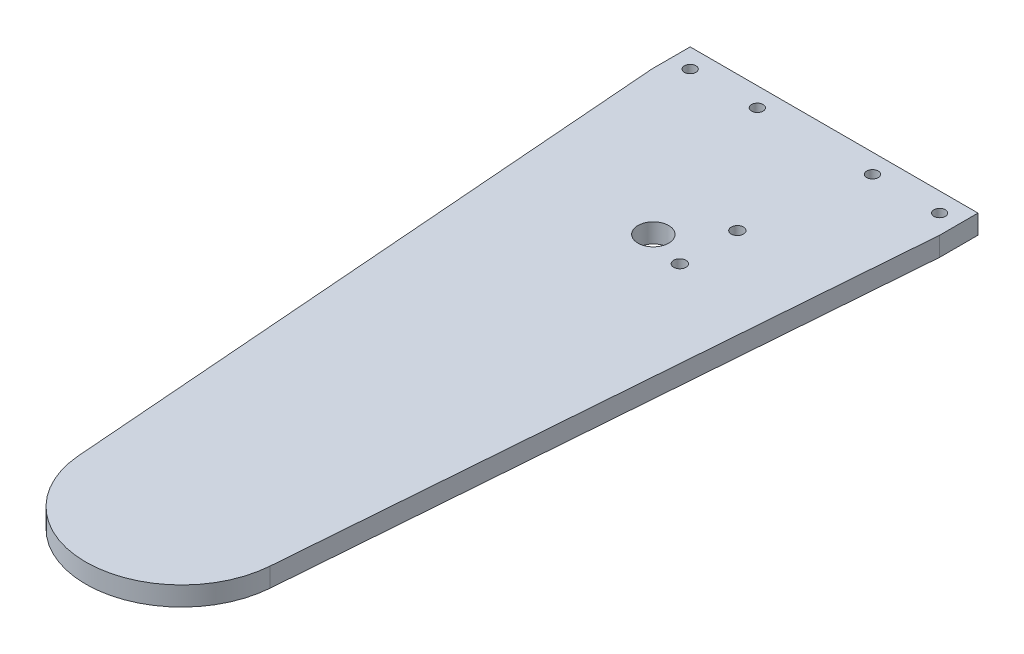
ISO-10303-21;
HEADER;
FILE_DESCRIPTION(('STEP AP214'),'2;1');
FILE_NAME('part.step','',(''),(''),'','','');
FILE_SCHEMA(('AUTOMOTIVE_DESIGN { 1 0 10303 214 1 1 1 1 }'));
ENDSEC;
DATA;
#1=APPLICATION_CONTEXT('core data for automotive mechanical design processes');
#2=APPLICATION_PROTOCOL_DEFINITION('international standard','automotive_design',2000,#1);
#3=PRODUCT_CONTEXT('',#1,'mechanical');
#4=PRODUCT('Part','Part','',(#3));
#5=PRODUCT_RELATED_PRODUCT_CATEGORY('part','',(#4));
#6=PRODUCT_DEFINITION_FORMATION('','',#4);
#7=PRODUCT_DEFINITION_CONTEXT('part definition',#1,'design');
#8=PRODUCT_DEFINITION('design','',#6,#7);
#9=PRODUCT_DEFINITION_SHAPE('','',#8);
#10=(LENGTH_UNIT() NAMED_UNIT(*) SI_UNIT(.MILLI.,.METRE.));
#11=(NAMED_UNIT(*) PLANE_ANGLE_UNIT() SI_UNIT($,.RADIAN.));
#12=(NAMED_UNIT(*) SI_UNIT($,.STERADIAN.) SOLID_ANGLE_UNIT());
#13=UNCERTAINTY_MEASURE_WITH_UNIT(LENGTH_MEASURE(1.E-05),#10,'distance_accuracy_value','');
#14=(GEOMETRIC_REPRESENTATION_CONTEXT(3) GLOBAL_UNCERTAINTY_ASSIGNED_CONTEXT((#13)) GLOBAL_UNIT_ASSIGNED_CONTEXT((#10,
#11,#12)) REPRESENTATION_CONTEXT('',''));
#15=CARTESIAN_POINT('',(0.,0.,0.));
#16=DIRECTION('',(0.,0.,1.));
#17=DIRECTION('',(1.,0.,0.));
#18=AXIS2_PLACEMENT_3D('',#15,#16,#17);
#19=CARTESIAN_POINT('',(37.5,5.,170.));
#20=DIRECTION('',(0.,1.,0.));
#21=DIRECTION('',(0.,0.,1.));
#22=AXIS2_PLACEMENT_3D('',#19,#20,#21);
#23=PLANE('',#22);
#24=CARTESIAN_POINT('',(47.6,5.,50.3));
#25=DIRECTION('',(0.,1.,0.));
#26=DIRECTION('',(0.,0.,1.));
#27=AXIS2_PLACEMENT_3D('',#24,#25,#26);
#28=CIRCLE('',#27,1.6);
#29=CARTESIAN_POINT('',(47.6,5.,51.9));
#30=VERTEX_POINT('',#29);
#31=EDGE_CURVE('E203',#30,#30,#28,.T.);
#32=ORIENTED_EDGE('',*,*,#31,.F.);
#33=EDGE_LOOP('',(#32));
#34=FACE_BOUND('',#33,.T.);
#35=CARTESIAN_POINT('',(52.5,5.,5.));
#36=DIRECTION('',(0.,1.,0.));
#37=DIRECTION('',(0.,0.,-1.));
#38=AXIS2_PLACEMENT_3D('',#35,#36,#37);
#39=CIRCLE('',#38,1.5);
#40=CARTESIAN_POINT('',(52.5,5.,3.5));
#41=VERTEX_POINT('',#40);
#42=EDGE_CURVE('E215',#41,#41,#39,.T.);
#43=ORIENTED_EDGE('',*,*,#42,.F.);
#44=EDGE_LOOP('',(#43));
#45=FACE_BOUND('',#44,.T.);
#46=CARTESIAN_POINT('',(70.,5.,4.99999999999999));
#47=DIRECTION('',(0.,1.,0.));
#48=DIRECTION('',(0.,0.,-1.));
#49=AXIS2_PLACEMENT_3D('',#46,#47,#48);
#50=CIRCLE('',#49,1.50000000000001);
#51=CARTESIAN_POINT('',(70.,5.,3.49999999999998));
#52=VERTEX_POINT('',#51);
#53=EDGE_CURVE('E227',#52,#52,#50,.T.);
#54=ORIENTED_EDGE('',*,*,#53,.F.);
#55=EDGE_LOOP('',(#54));
#56=FACE_BOUND('',#55,.T.);
#57=DIRECTION('',(-1.,0.,0.));
#58=VECTOR('',#57,1.);
#59=CARTESIAN_POINT('',(75.,5.,0.));
#60=LINE('',#59,#58);
#61=CARTESIAN_POINT('',(75.,5.,0.));
#62=VERTEX_POINT('',#61);
#63=CARTESIAN_POINT('',(0.,5.,0.));
#64=VERTEX_POINT('',#63);
#65=EDGE_CURVE('E131',#62,#64,#60,.T.);
#66=ORIENTED_EDGE('',*,*,#65,.T.);
#67=DIRECTION('',(0.,0.,1.));
#68=VECTOR('',#67,1.);
#69=CARTESIAN_POINT('',(0.,5.,0.));
#70=LINE('',#69,#68);
#71=CARTESIAN_POINT('',(0.,5.,10.));
#72=VERTEX_POINT('',#71);
#73=EDGE_CURVE('E89',#64,#72,#70,.T.);
#74=ORIENTED_EDGE('',*,*,#73,.T.);
#75=DIRECTION('',(0.0774215117442369,0.,0.996998450108744));
#76=VECTOR('',#75,1.);
#77=CARTESIAN_POINT('',(0.,5.,10.));
#78=LINE('',#77,#76);
#79=CARTESIAN_POINT('',(12.5750387472814,5.,171.935537793606));
#80=VERTEX_POINT('',#79);
#81=EDGE_CURVE('E102',#72,#80,#78,.T.);
#82=ORIENTED_EDGE('',*,*,#81,.T.);
#83=CARTESIAN_POINT('',(37.5,5.,170.));
#84=DIRECTION('',(0.,1.,0.));
#85=DIRECTION('',(0.,0.,1.));
#86=AXIS2_PLACEMENT_3D('',#83,#84,#85);
#87=CIRCLE('',#86,25.);
#88=CARTESIAN_POINT('',(62.4249612527186,5.,171.935537793606));
#89=VERTEX_POINT('',#88);
#90=EDGE_CURVE('E96',#80,#89,#87,.T.);
#91=ORIENTED_EDGE('',*,*,#90,.T.);
#92=DIRECTION('',(0.0774215117442367,0.,-0.996998450108744));
#93=VECTOR('',#92,1.);
#94=CARTESIAN_POINT('',(62.4249612527186,5.,171.935537793606));
#95=LINE('',#94,#93);
#96=CARTESIAN_POINT('',(75.,5.,10.));
#97=VERTEX_POINT('',#96);
#98=EDGE_CURVE('E100',#89,#97,#95,.T.);
#99=ORIENTED_EDGE('',*,*,#98,.T.);
#100=DIRECTION('',(0.,0.,-1.));
#101=VECTOR('',#100,1.);
#102=CARTESIAN_POINT('',(75.,5.,10.));
#103=LINE('',#102,#101);
#104=EDGE_CURVE('E52',#97,#62,#103,.T.);
#105=ORIENTED_EDGE('',*,*,#104,.T.);
#106=EDGE_LOOP('',(#66,#74,#82,#91,#99,#105));
#107=FACE_BOUND('',#106,.T.);
#108=CARTESIAN_POINT('',(5.,5.,5.));
#109=DIRECTION('',(0.,1.,0.));
#110=DIRECTION('',(0.,0.,1.));
#111=AXIS2_PLACEMENT_3D('',#108,#109,#110);
#112=CIRCLE('',#111,1.5);
#113=CARTESIAN_POINT('',(5.,5.,6.5));
#114=VERTEX_POINT('',#113);
#115=EDGE_CURVE('E124',#114,#114,#112,.T.);
#116=ORIENTED_EDGE('',*,*,#115,.F.);
#117=EDGE_LOOP('',(#116));
#118=FACE_BOUND('',#117,.T.);
#119=CARTESIAN_POINT('',(22.5,5.,5.));
#120=DIRECTION('',(0.,1.,0.));
#121=DIRECTION('',(0.,0.,1.));
#122=AXIS2_PLACEMENT_3D('',#119,#120,#121);
#123=CIRCLE('',#122,1.5);
#124=CARTESIAN_POINT('',(22.5,5.,6.5));
#125=VERTEX_POINT('',#124);
#126=EDGE_CURVE('E221',#125,#125,#123,.T.);
#127=ORIENTED_EDGE('',*,*,#126,.F.);
#128=EDGE_LOOP('',(#127));
#129=FACE_BOUND('',#128,.T.);
#130=CARTESIAN_POINT('',(47.6,5.,35.3));
#131=DIRECTION('',(0.,1.,0.));
#132=DIRECTION('',(0.,0.,1.));
#133=AXIS2_PLACEMENT_3D('',#130,#131,#132);
#134=CIRCLE('',#133,1.6);
#135=CARTESIAN_POINT('',(47.6,5.,36.9));
#136=VERTEX_POINT('',#135);
#137=EDGE_CURVE('E209',#136,#136,#134,.T.);
#138=ORIENTED_EDGE('',*,*,#137,.F.);
#139=EDGE_LOOP('',(#138));
#140=FACE_BOUND('',#139,.T.);
#141=CARTESIAN_POINT('',(37.5,5.,47.1));
#142=DIRECTION('',(0.,1.,0.));
#143=DIRECTION('',(0.,0.,1.));
#144=AXIS2_PLACEMENT_3D('',#141,#142,#143);
#145=CIRCLE('',#144,4.00000000000001);
#146=CARTESIAN_POINT('',(37.5,5.,51.1));
#147=VERTEX_POINT('',#146);
#148=EDGE_CURVE('E194',#147,#147,#145,.T.);
#149=ORIENTED_EDGE('',*,*,#148,.F.);
#150=EDGE_LOOP('',(#149));
#151=FACE_BOUND('',#150,.T.);
#152=ADVANCED_FACE('F35',(#34,#45,#56,#107,#118,#129,#140,#151),#23,.T.);
#153=CARTESIAN_POINT('',(37.5,0.,170.));
#154=DIRECTION('',(0.,1.,0.));
#155=DIRECTION('',(0.,0.,1.));
#156=AXIS2_PLACEMENT_3D('',#153,#154,#155);
#157=PLANE('',#156);
#158=DIRECTION('',(-1.,0.,0.));
#159=VECTOR('',#158,1.);
#160=CARTESIAN_POINT('',(75.,0.,0.));
#161=LINE('',#160,#159);
#162=CARTESIAN_POINT('',(75.,0.,0.));
#163=VERTEX_POINT('',#162);
#164=CARTESIAN_POINT('',(0.,0.,0.));
#165=VERTEX_POINT('',#164);
#166=EDGE_CURVE('E120',#163,#165,#161,.T.);
#167=ORIENTED_EDGE('',*,*,#166,.F.);
#168=DIRECTION('',(0.,0.,-1.));
#169=VECTOR('',#168,1.);
#170=CARTESIAN_POINT('',(75.,0.,10.));
#171=LINE('',#170,#169);
#172=CARTESIAN_POINT('',(75.,0.,10.));
#173=VERTEX_POINT('',#172);
#174=EDGE_CURVE('E81',#173,#163,#171,.T.);
#175=ORIENTED_EDGE('',*,*,#174,.F.);
#176=DIRECTION('',(0.0774215117442367,0.,-0.996998450108744));
#177=VECTOR('',#176,1.);
#178=CARTESIAN_POINT('',(62.4249612527186,0.,171.935537793606));
#179=LINE('',#178,#177);
#180=CARTESIAN_POINT('',(62.4249612527186,0.,171.935537793606));
#181=VERTEX_POINT('',#180);
#182=EDGE_CURVE('E75',#181,#173,#179,.T.);
#183=ORIENTED_EDGE('',*,*,#182,.F.);
#184=CARTESIAN_POINT('',(37.5,0.,170.));
#185=DIRECTION('',(0.,1.,0.));
#186=DIRECTION('',(0.,0.,1.));
#187=AXIS2_PLACEMENT_3D('',#184,#185,#186);
#188=CIRCLE('',#187,25.);
#189=CARTESIAN_POINT('',(12.5750387472814,0.,171.935537793606));
#190=VERTEX_POINT('',#189);
#191=EDGE_CURVE('E110',#190,#181,#188,.T.);
#192=ORIENTED_EDGE('',*,*,#191,.F.);
#193=DIRECTION('',(0.0774215117442369,0.,0.996998450108744));
#194=VECTOR('',#193,1.);
#195=CARTESIAN_POINT('',(0.,0.,10.));
#196=LINE('',#195,#194);
#197=CARTESIAN_POINT('',(0.,0.,10.));
#198=VERTEX_POINT('',#197);
#199=EDGE_CURVE('E126',#198,#190,#196,.T.);
#200=ORIENTED_EDGE('',*,*,#199,.F.);
#201=DIRECTION('',(0.,0.,1.));
#202=VECTOR('',#201,1.);
#203=CARTESIAN_POINT('',(0.,0.,0.));
#204=LINE('',#203,#202);
#205=EDGE_CURVE('E123',#165,#198,#204,.T.);
#206=ORIENTED_EDGE('',*,*,#205,.F.);
#207=EDGE_LOOP('',(#167,#175,#183,#192,#200,#206));
#208=FACE_BOUND('',#207,.T.);
#209=CARTESIAN_POINT('',(5.,0.,5.));
#210=DIRECTION('',(0.,1.,0.));
#211=DIRECTION('',(0.,0.,1.));
#212=AXIS2_PLACEMENT_3D('',#209,#210,#211);
#213=CIRCLE('',#212,1.5);
#214=CARTESIAN_POINT('',(5.,0.,6.5));
#215=VERTEX_POINT('',#214);
#216=EDGE_CURVE('E230',#215,#215,#213,.T.);
#217=ORIENTED_EDGE('',*,*,#216,.T.);
#218=EDGE_LOOP('',(#217));
#219=FACE_BOUND('',#218,.T.);
#220=CARTESIAN_POINT('',(70.,0.,4.99999999999999));
#221=DIRECTION('',(0.,1.,0.));
#222=DIRECTION('',(0.,0.,-1.));
#223=AXIS2_PLACEMENT_3D('',#220,#221,#222);
#224=CIRCLE('',#223,1.50000000000001);
#225=CARTESIAN_POINT('',(70.,0.,3.49999999999998));
#226=VERTEX_POINT('',#225);
#227=EDGE_CURVE('E224',#226,#226,#224,.T.);
#228=ORIENTED_EDGE('',*,*,#227,.T.);
#229=EDGE_LOOP('',(#228));
#230=FACE_BOUND('',#229,.T.);
#231=CARTESIAN_POINT('',(22.5,0.,5.));
#232=DIRECTION('',(0.,1.,0.));
#233=DIRECTION('',(0.,0.,1.));
#234=AXIS2_PLACEMENT_3D('',#231,#232,#233);
#235=CIRCLE('',#234,1.5);
#236=CARTESIAN_POINT('',(22.5,0.,6.5));
#237=VERTEX_POINT('',#236);
#238=EDGE_CURVE('E218',#237,#237,#235,.T.);
#239=ORIENTED_EDGE('',*,*,#238,.T.);
#240=EDGE_LOOP('',(#239));
#241=FACE_BOUND('',#240,.T.);
#242=CARTESIAN_POINT('',(52.5,0.,5.));
#243=DIRECTION('',(0.,1.,0.));
#244=DIRECTION('',(0.,0.,-1.));
#245=AXIS2_PLACEMENT_3D('',#242,#243,#244);
#246=CIRCLE('',#245,1.5);
#247=CARTESIAN_POINT('',(52.5,0.,3.5));
#248=VERTEX_POINT('',#247);
#249=EDGE_CURVE('E212',#248,#248,#246,.T.);
#250=ORIENTED_EDGE('',*,*,#249,.T.);
#251=EDGE_LOOP('',(#250));
#252=FACE_BOUND('',#251,.T.);
#253=CARTESIAN_POINT('',(47.6,0.,35.3));
#254=DIRECTION('',(0.,1.,0.));
#255=DIRECTION('',(0.,0.,1.));
#256=AXIS2_PLACEMENT_3D('',#253,#254,#255);
#257=CIRCLE('',#256,1.6);
#258=CARTESIAN_POINT('',(47.6,0.,36.9));
#259=VERTEX_POINT('',#258);
#260=EDGE_CURVE('E206',#259,#259,#257,.T.);
#261=ORIENTED_EDGE('',*,*,#260,.T.);
#262=EDGE_LOOP('',(#261));
#263=FACE_BOUND('',#262,.T.);
#264=CARTESIAN_POINT('',(47.6,0.,50.3));
#265=DIRECTION('',(0.,1.,0.));
#266=DIRECTION('',(0.,0.,1.));
#267=AXIS2_PLACEMENT_3D('',#264,#265,#266);
#268=CIRCLE('',#267,1.6);
#269=CARTESIAN_POINT('',(47.6,0.,51.9));
#270=VERTEX_POINT('',#269);
#271=EDGE_CURVE('E200',#270,#270,#268,.T.);
#272=ORIENTED_EDGE('',*,*,#271,.T.);
#273=EDGE_LOOP('',(#272));
#274=FACE_BOUND('',#273,.T.);
#275=CARTESIAN_POINT('',(37.5,0.,47.1));
#276=DIRECTION('',(0.,1.,0.));
#277=DIRECTION('',(0.,0.,1.));
#278=AXIS2_PLACEMENT_3D('',#275,#276,#277);
#279=CIRCLE('',#278,4.00000000000001);
#280=CARTESIAN_POINT('',(37.5,0.,51.1));
#281=VERTEX_POINT('',#280);
#282=EDGE_CURVE('E197',#281,#281,#279,.T.);
#283=ORIENTED_EDGE('',*,*,#282,.T.);
#284=EDGE_LOOP('',(#283));
#285=FACE_BOUND('',#284,.T.);
#286=ADVANCED_FACE('F140',(#208,#219,#230,#241,#252,#263,#274,#285),#157,.F.);
#287=CARTESIAN_POINT('',(75.,5.,0.));
#288=DIRECTION('',(0.,0.,1.));
#289=DIRECTION('',(1.,0.,0.));
#290=AXIS2_PLACEMENT_3D('',#287,#288,#289);
#291=PLANE('',#290);
#292=ORIENTED_EDGE('',*,*,#166,.T.);
#293=DIRECTION('',(0.,-1.,0.));
#294=VECTOR('',#293,1.);
#295=CARTESIAN_POINT('',(0.,5.,0.));
#296=LINE('',#295,#294);
#297=EDGE_CURVE('E11',#64,#165,#296,.T.);
#298=ORIENTED_EDGE('',*,*,#297,.F.);
#299=ORIENTED_EDGE('',*,*,#65,.F.);
#300=DIRECTION('',(0.,-1.,0.));
#301=VECTOR('',#300,1.);
#302=CARTESIAN_POINT('',(75.,5.,0.));
#303=LINE('',#302,#301);
#304=EDGE_CURVE('E116',#62,#163,#303,.T.);
#305=ORIENTED_EDGE('',*,*,#304,.T.);
#306=EDGE_LOOP('',(#292,#298,#299,#305));
#307=FACE_BOUND('',#306,.T.);
#308=ADVANCED_FACE('F37',(#307),#291,.F.);
#309=CARTESIAN_POINT('',(0.,5.,0.));
#310=DIRECTION('',(1.,0.,0.));
#311=DIRECTION('',(0.,0.,-1.));
#312=AXIS2_PLACEMENT_3D('',#309,#310,#311);
#313=PLANE('',#312);
#314=ORIENTED_EDGE('',*,*,#205,.T.);
#315=DIRECTION('',(0.,-1.,0.));
#316=VECTOR('',#315,1.);
#317=CARTESIAN_POINT('',(0.,5.,10.));
#318=LINE('',#317,#316);
#319=EDGE_CURVE('E44',#72,#198,#318,.T.);
#320=ORIENTED_EDGE('',*,*,#319,.F.);
#321=ORIENTED_EDGE('',*,*,#73,.F.);
#322=ORIENTED_EDGE('',*,*,#297,.T.);
#323=EDGE_LOOP('',(#314,#320,#321,#322));
#324=FACE_BOUND('',#323,.T.);
#325=ADVANCED_FACE('F315',(#324),#313,.F.);
#326=CARTESIAN_POINT('',(0.,5.,10.));
#327=DIRECTION('',(0.996998450108744,0.,-0.0774215117442369));
#328=DIRECTION('',(-0.0774215117442369,0.,-0.996998450108744));
#329=AXIS2_PLACEMENT_3D('',#326,#327,#328);
#330=PLANE('',#329);
#331=ORIENTED_EDGE('',*,*,#199,.T.);
#332=DIRECTION('',(0.,-1.,0.));
#333=VECTOR('',#332,1.);
#334=CARTESIAN_POINT('',(12.5750387472814,5.,171.935537793606));
#335=LINE('',#334,#333);
#336=EDGE_CURVE('E111',#80,#190,#335,.T.);
#337=ORIENTED_EDGE('',*,*,#336,.F.);
#338=ORIENTED_EDGE('',*,*,#81,.F.);
#339=ORIENTED_EDGE('',*,*,#319,.T.);
#340=EDGE_LOOP('',(#331,#337,#338,#339));
#341=FACE_BOUND('',#340,.T.);
#342=ADVANCED_FACE('F137',(#341),#330,.F.);
#343=CARTESIAN_POINT('',(37.5,5.,170.));
#344=DIRECTION('',(0.,-1.,0.));
#345=DIRECTION('',(0.,0.,-1.));
#346=AXIS2_PLACEMENT_3D('',#343,#344,#345);
#347=CYLINDRICAL_SURFACE('',#346,25.);
#348=ORIENTED_EDGE('',*,*,#191,.T.);
#349=DIRECTION('',(0.,-1.,0.));
#350=VECTOR('',#349,1.);
#351=CARTESIAN_POINT('',(62.4249612527186,5.,171.935537793606));
#352=LINE('',#351,#350);
#353=EDGE_CURVE('E107',#89,#181,#352,.T.);
#354=ORIENTED_EDGE('',*,*,#353,.F.);
#355=ORIENTED_EDGE('',*,*,#90,.F.);
#356=ORIENTED_EDGE('',*,*,#336,.T.);
#357=EDGE_LOOP('',(#348,#354,#355,#356));
#358=FACE_BOUND('',#357,.T.);
#359=ADVANCED_FACE('F108',(#358),#347,.T.);
#360=CARTESIAN_POINT('',(62.4249612527186,5.,171.935537793606));
#361=DIRECTION('',(-0.996998450108744,0.,-0.0774215117442367));
#362=DIRECTION('',(-0.0774215117442367,0.,0.996998450108744));
#363=AXIS2_PLACEMENT_3D('',#360,#361,#362);
#364=PLANE('',#363);
#365=ORIENTED_EDGE('',*,*,#182,.T.);
#366=DIRECTION('',(0.,-1.,0.));
#367=VECTOR('',#366,1.);
#368=CARTESIAN_POINT('',(75.,5.,10.));
#369=LINE('',#368,#367);
#370=EDGE_CURVE('E112',#97,#173,#369,.T.);
#371=ORIENTED_EDGE('',*,*,#370,.F.);
#372=ORIENTED_EDGE('',*,*,#98,.F.);
#373=ORIENTED_EDGE('',*,*,#353,.T.);
#374=EDGE_LOOP('',(#365,#371,#372,#373));
#375=FACE_BOUND('',#374,.T.);
#376=ADVANCED_FACE('F114',(#375),#364,.F.);
#377=CARTESIAN_POINT('',(75.,5.,10.));
#378=DIRECTION('',(-1.,0.,0.));
#379=DIRECTION('',(0.,0.,1.));
#380=AXIS2_PLACEMENT_3D('',#377,#378,#379);
#381=PLANE('',#380);
#382=ORIENTED_EDGE('',*,*,#174,.T.);
#383=ORIENTED_EDGE('',*,*,#304,.F.);
#384=ORIENTED_EDGE('',*,*,#104,.F.);
#385=ORIENTED_EDGE('',*,*,#370,.T.);
#386=EDGE_LOOP('',(#382,#383,#384,#385));
#387=FACE_BOUND('',#386,.T.);
#388=ADVANCED_FACE('F145',(#387),#381,.F.);
#389=CARTESIAN_POINT('',(5.,5.,5.));
#390=DIRECTION('',(0.,-1.,0.));
#391=DIRECTION('',(0.,0.,-1.));
#392=AXIS2_PLACEMENT_3D('',#389,#390,#391);
#393=CYLINDRICAL_SURFACE('',#392,1.5);
#394=ORIENTED_EDGE('',*,*,#115,.T.);
#395=EDGE_LOOP('',(#394));
#396=FACE_BOUND('',#395,.T.);
#397=ORIENTED_EDGE('',*,*,#216,.F.);
#398=EDGE_LOOP('',(#397));
#399=FACE_BOUND('',#398,.T.);
#400=ADVANCED_FACE('F147',(#396,#399),#393,.F.);
#401=CARTESIAN_POINT('',(70.,5.,4.99999999999999));
#402=DIRECTION('',(0.,-1.,0.));
#403=DIRECTION('',(0.,0.,-1.));
#404=AXIS2_PLACEMENT_3D('',#401,#402,#403);
#405=CYLINDRICAL_SURFACE('',#404,1.50000000000001);
#406=ORIENTED_EDGE('',*,*,#53,.T.);
#407=EDGE_LOOP('',(#406));
#408=FACE_BOUND('',#407,.T.);
#409=ORIENTED_EDGE('',*,*,#227,.F.);
#410=EDGE_LOOP('',(#409));
#411=FACE_BOUND('',#410,.T.);
#412=ADVANCED_FACE('F153',(#408,#411),#405,.F.);
#413=CARTESIAN_POINT('',(22.5,5.,5.));
#414=DIRECTION('',(0.,-1.,0.));
#415=DIRECTION('',(0.,0.,-1.));
#416=AXIS2_PLACEMENT_3D('',#413,#414,#415);
#417=CYLINDRICAL_SURFACE('',#416,1.5);
#418=ORIENTED_EDGE('',*,*,#126,.T.);
#419=EDGE_LOOP('',(#418));
#420=FACE_BOUND('',#419,.T.);
#421=ORIENTED_EDGE('',*,*,#238,.F.);
#422=EDGE_LOOP('',(#421));
#423=FACE_BOUND('',#422,.T.);
#424=ADVANCED_FACE('F169',(#420,#423),#417,.F.);
#425=CARTESIAN_POINT('',(52.5,5.,5.));
#426=DIRECTION('',(0.,-1.,0.));
#427=DIRECTION('',(0.,0.,-1.));
#428=AXIS2_PLACEMENT_3D('',#425,#426,#427);
#429=CYLINDRICAL_SURFACE('',#428,1.5);
#430=ORIENTED_EDGE('',*,*,#42,.T.);
#431=EDGE_LOOP('',(#430));
#432=FACE_BOUND('',#431,.T.);
#433=ORIENTED_EDGE('',*,*,#249,.F.);
#434=EDGE_LOOP('',(#433));
#435=FACE_BOUND('',#434,.T.);
#436=ADVANCED_FACE('F173',(#432,#435),#429,.F.);
#437=CARTESIAN_POINT('',(47.6,5.,35.3));
#438=DIRECTION('',(0.,-1.,0.));
#439=DIRECTION('',(0.,0.,-1.));
#440=AXIS2_PLACEMENT_3D('',#437,#438,#439);
#441=CYLINDRICAL_SURFACE('',#440,1.6);
#442=ORIENTED_EDGE('',*,*,#137,.T.);
#443=EDGE_LOOP('',(#442));
#444=FACE_BOUND('',#443,.T.);
#445=ORIENTED_EDGE('',*,*,#260,.F.);
#446=EDGE_LOOP('',(#445));
#447=FACE_BOUND('',#446,.T.);
#448=ADVANCED_FACE('F177',(#444,#447),#441,.F.);
#449=CARTESIAN_POINT('',(47.6,5.,50.3));
#450=DIRECTION('',(0.,-1.,0.));
#451=DIRECTION('',(0.,0.,-1.));
#452=AXIS2_PLACEMENT_3D('',#449,#450,#451);
#453=CYLINDRICAL_SURFACE('',#452,1.6);
#454=ORIENTED_EDGE('',*,*,#31,.T.);
#455=EDGE_LOOP('',(#454));
#456=FACE_BOUND('',#455,.T.);
#457=ORIENTED_EDGE('',*,*,#271,.F.);
#458=EDGE_LOOP('',(#457));
#459=FACE_BOUND('',#458,.T.);
#460=ADVANCED_FACE('F181',(#456,#459),#453,.F.);
#461=CARTESIAN_POINT('',(37.5,5.,47.1));
#462=DIRECTION('',(0.,-1.,0.));
#463=DIRECTION('',(0.,0.,-1.));
#464=AXIS2_PLACEMENT_3D('',#461,#462,#463);
#465=CYLINDRICAL_SURFACE('',#464,4.00000000000001);
#466=ORIENTED_EDGE('',*,*,#148,.T.);
#467=EDGE_LOOP('',(#466));
#468=FACE_BOUND('',#467,.T.);
#469=ORIENTED_EDGE('',*,*,#282,.F.);
#470=EDGE_LOOP('',(#469));
#471=FACE_BOUND('',#470,.T.);
#472=ADVANCED_FACE('F185',(#468,#471),#465,.F.);
#473=CLOSED_SHELL('',(#152,#286,#308,#325,#342,#359,#376,#388,#400,#412,#424,#436,#448,#460,#472));
#474=MANIFOLD_SOLID_BREP('B2',#473);
#475=ADVANCED_BREP_SHAPE_REPRESENTATION('',(#18,#474),#14);
#476=SHAPE_DEFINITION_REPRESENTATION(#9,#475);
ENDSEC;
END-ISO-10303-21;
